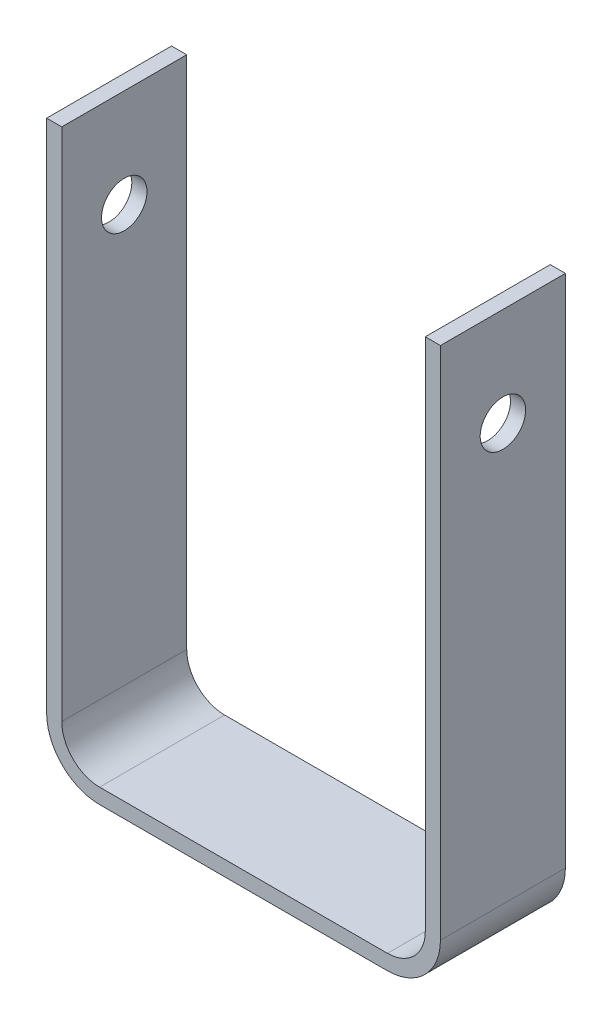
ISO-10303-21;
HEADER;
FILE_DESCRIPTION(('STEP AP214'),'2;1');
FILE_NAME('part.step','',(''),(''),'','','');
FILE_SCHEMA(('AUTOMOTIVE_DESIGN { 1 0 10303 214 1 1 1 1 }'));
ENDSEC;
DATA;
#1=APPLICATION_CONTEXT('core data for automotive mechanical design processes');
#2=APPLICATION_PROTOCOL_DEFINITION('international standard','automotive_design',2000,#1);
#3=PRODUCT_CONTEXT('',#1,'mechanical');
#4=PRODUCT('Part','Part','',(#3));
#5=PRODUCT_RELATED_PRODUCT_CATEGORY('part','',(#4));
#6=PRODUCT_DEFINITION_FORMATION('','',#4);
#7=PRODUCT_DEFINITION_CONTEXT('part definition',#1,'design');
#8=PRODUCT_DEFINITION('design','',#6,#7);
#9=PRODUCT_DEFINITION_SHAPE('','',#8);
#10=(LENGTH_UNIT() NAMED_UNIT(*) SI_UNIT(.MILLI.,.METRE.));
#11=(NAMED_UNIT(*) PLANE_ANGLE_UNIT() SI_UNIT($,.RADIAN.));
#12=(NAMED_UNIT(*) SI_UNIT($,.STERADIAN.) SOLID_ANGLE_UNIT());
#13=UNCERTAINTY_MEASURE_WITH_UNIT(LENGTH_MEASURE(1.E-05),#10,'distance_accuracy_value','');
#14=(GEOMETRIC_REPRESENTATION_CONTEXT(3) GLOBAL_UNCERTAINTY_ASSIGNED_CONTEXT((#13)) GLOBAL_UNIT_ASSIGNED_CONTEXT((#10,
#11,#12)) REPRESENTATION_CONTEXT('',''));
#15=CARTESIAN_POINT('',(0.,0.,0.));
#16=DIRECTION('',(0.,0.,1.));
#17=DIRECTION('',(1.,0.,0.));
#18=AXIS2_PLACEMENT_3D('',#15,#16,#17);
#19=CARTESIAN_POINT('',(38.,14.,33.));
#20=DIRECTION('',(0.,0.,-1.));
#21=DIRECTION('',(-1.,0.,0.));
#22=AXIS2_PLACEMENT_3D('',#19,#20,#21);
#23=CYLINDRICAL_SURFACE('',#22,14.);
#24=CARTESIAN_POINT('',(38.,14.,0.));
#25=DIRECTION('',(0.,0.,1.));
#26=DIRECTION('',(1.,0.,0.));
#27=AXIS2_PLACEMENT_3D('',#24,#25,#26);
#28=CIRCLE('',#27,14.);
#29=CARTESIAN_POINT('',(37.9999999999999,0.,0.));
#30=VERTEX_POINT('',#29);
#31=CARTESIAN_POINT('',(52.,14.0000000000001,0.));
#32=VERTEX_POINT('',#31);
#33=EDGE_CURVE('E155',#30,#32,#28,.T.);
#34=ORIENTED_EDGE('',*,*,#33,.T.);
#35=DIRECTION('',(0.,0.,-1.));
#36=VECTOR('',#35,1.);
#37=CARTESIAN_POINT('',(52.,14.0000000000001,33.));
#38=LINE('',#37,#36);
#39=CARTESIAN_POINT('',(52.,14.0000000000001,33.));
#40=VERTEX_POINT('',#39);
#41=EDGE_CURVE('E11',#40,#32,#38,.T.);
#42=ORIENTED_EDGE('',*,*,#41,.F.);
#43=CARTESIAN_POINT('',(38.,14.,33.));
#44=DIRECTION('',(0.,0.,1.));
#45=DIRECTION('',(1.,0.,0.));
#46=AXIS2_PLACEMENT_3D('',#43,#44,#45);
#47=CIRCLE('',#46,14.);
#48=CARTESIAN_POINT('',(37.9999999999999,0.,33.));
#49=VERTEX_POINT('',#48);
#50=EDGE_CURVE('E180',#49,#40,#47,.T.);
#51=ORIENTED_EDGE('',*,*,#50,.F.);
#52=DIRECTION('',(0.,0.,-1.));
#53=VECTOR('',#52,1.);
#54=CARTESIAN_POINT('',(37.9999999999999,0.,33.));
#55=LINE('',#54,#53);
#56=EDGE_CURVE('E151',#49,#30,#55,.T.);
#57=ORIENTED_EDGE('',*,*,#56,.T.);
#58=EDGE_LOOP('',(#34,#42,#51,#57));
#59=FACE_BOUND('',#58,.T.);
#60=ADVANCED_FACE('F34',(#59),#23,.T.);
#61=CARTESIAN_POINT('',(52.,14.0000000000001,33.));
#62=DIRECTION('',(-1.,0.,0.));
#63=DIRECTION('',(0.,0.,1.));
#64=AXIS2_PLACEMENT_3D('',#61,#62,#63);
#65=PLANE('',#64);
#66=CARTESIAN_POINT('',(52.,124.,16.5));
#67=DIRECTION('',(-1.,0.,0.));
#68=DIRECTION('',(0.,0.,1.));
#69=AXIS2_PLACEMENT_3D('',#66,#67,#68);
#70=CIRCLE('',#69,6.);
#71=CARTESIAN_POINT('',(52.,124.,10.5));
#72=VERTEX_POINT('',#71);
#73=EDGE_CURVE('E159',#72,#72,#70,.T.);
#74=ORIENTED_EDGE('',*,*,#73,.T.);
#75=EDGE_LOOP('',(#74));
#76=FACE_BOUND('',#75,.T.);
#77=DIRECTION('',(0.,1.,0.));
#78=VECTOR('',#77,1.);
#79=CARTESIAN_POINT('',(52.,14.0000000000001,0.));
#80=LINE('',#79,#78);
#81=CARTESIAN_POINT('',(52.,150.,0.));
#82=VERTEX_POINT('',#81);
#83=EDGE_CURVE('E158',#32,#82,#80,.T.);
#84=ORIENTED_EDGE('',*,*,#83,.T.);
#85=DIRECTION('',(0.,0.,-1.));
#86=VECTOR('',#85,1.);
#87=CARTESIAN_POINT('',(52.,150.,33.));
#88=LINE('',#87,#86);
#89=CARTESIAN_POINT('',(52.,150.,33.));
#90=VERTEX_POINT('',#89);
#91=EDGE_CURVE('E42',#90,#82,#88,.T.);
#92=ORIENTED_EDGE('',*,*,#91,.F.);
#93=DIRECTION('',(0.,1.,0.));
#94=VECTOR('',#93,1.);
#95=CARTESIAN_POINT('',(52.,14.0000000000001,33.));
#96=LINE('',#95,#94);
#97=EDGE_CURVE('E103',#40,#90,#96,.T.);
#98=ORIENTED_EDGE('',*,*,#97,.F.);
#99=ORIENTED_EDGE('',*,*,#41,.T.);
#100=EDGE_LOOP('',(#84,#92,#98,#99));
#101=FACE_BOUND('',#100,.T.);
#102=ADVANCED_FACE('F280',(#76,#101),#65,.F.);
#103=CARTESIAN_POINT('',(48.,150.,33.));
#104=DIRECTION('',(0.,-1.,0.));
#105=DIRECTION('',(0.,0.,-1.));
#106=AXIS2_PLACEMENT_3D('',#103,#104,#105);
#107=PLANE('',#106);
#108=DIRECTION('',(-1.,0.,0.));
#109=VECTOR('',#108,1.);
#110=CARTESIAN_POINT('',(48.,150.,0.));
#111=LINE('',#110,#109);
#112=CARTESIAN_POINT('',(48.,150.,0.));
#113=VERTEX_POINT('',#112);
#114=EDGE_CURVE('E161',#82,#113,#111,.T.);
#115=ORIENTED_EDGE('',*,*,#114,.T.);
#116=DIRECTION('',(0.,0.,-1.));
#117=VECTOR('',#116,1.);
#118=CARTESIAN_POINT('',(48.,150.,33.));
#119=LINE('',#118,#117);
#120=CARTESIAN_POINT('',(48.,150.,33.));
#121=VERTEX_POINT('',#120);
#122=EDGE_CURVE('E199',#121,#113,#119,.T.);
#123=ORIENTED_EDGE('',*,*,#122,.F.);
#124=DIRECTION('',(-1.,0.,0.));
#125=VECTOR('',#124,1.);
#126=CARTESIAN_POINT('',(48.,150.,33.));
#127=LINE('',#126,#125);
#128=EDGE_CURVE('E207',#90,#121,#127,.T.);
#129=ORIENTED_EDGE('',*,*,#128,.F.);
#130=ORIENTED_EDGE('',*,*,#91,.T.);
#131=EDGE_LOOP('',(#115,#123,#129,#130));
#132=FACE_BOUND('',#131,.T.);
#133=ADVANCED_FACE('F205',(#132),#107,.F.);
#134=CARTESIAN_POINT('',(48.,14.0000000000001,33.));
#135=DIRECTION('',(1.,0.,0.));
#136=DIRECTION('',(0.,0.,-1.));
#137=AXIS2_PLACEMENT_3D('',#134,#135,#136);
#138=PLANE('',#137);
#139=CARTESIAN_POINT('',(48.,124.,16.5));
#140=DIRECTION('',(1.,0.,0.));
#141=DIRECTION('',(0.,0.,-1.));
#142=AXIS2_PLACEMENT_3D('',#139,#140,#141);
#143=CIRCLE('',#142,6.);
#144=CARTESIAN_POINT('',(48.,124.,10.5));
#145=VERTEX_POINT('',#144);
#146=EDGE_CURVE('E250',#145,#145,#143,.T.);
#147=ORIENTED_EDGE('',*,*,#146,.T.);
#148=EDGE_LOOP('',(#147));
#149=FACE_BOUND('',#148,.T.);
#150=DIRECTION('',(0.,-1.,0.));
#151=VECTOR('',#150,1.);
#152=CARTESIAN_POINT('',(48.,14.0000000000001,0.));
#153=LINE('',#152,#151);
#154=CARTESIAN_POINT('',(48.,14.0000000000001,0.));
#155=VERTEX_POINT('',#154);
#156=EDGE_CURVE('E163',#113,#155,#153,.T.);
#157=ORIENTED_EDGE('',*,*,#156,.T.);
#158=DIRECTION('',(0.,0.,-1.));
#159=VECTOR('',#158,1.);
#160=CARTESIAN_POINT('',(48.,14.0000000000001,33.));
#161=LINE('',#160,#159);
#162=CARTESIAN_POINT('',(48.,14.0000000000001,33.));
#163=VERTEX_POINT('',#162);
#164=EDGE_CURVE('E196',#163,#155,#161,.T.);
#165=ORIENTED_EDGE('',*,*,#164,.F.);
#166=DIRECTION('',(0.,-1.,0.));
#167=VECTOR('',#166,1.);
#168=CARTESIAN_POINT('',(48.,14.0000000000001,33.));
#169=LINE('',#168,#167);
#170=EDGE_CURVE('E222',#121,#163,#169,.T.);
#171=ORIENTED_EDGE('',*,*,#170,.F.);
#172=ORIENTED_EDGE('',*,*,#122,.T.);
#173=EDGE_LOOP('',(#157,#165,#171,#172));
#174=FACE_BOUND('',#173,.T.);
#175=ADVANCED_FACE('F213',(#149,#174),#138,.F.);
#176=CARTESIAN_POINT('',(38.,14.,33.));
#177=DIRECTION('',(0.,0.,-1.));
#178=DIRECTION('',(-1.,0.,0.));
#179=AXIS2_PLACEMENT_3D('',#176,#177,#178);
#180=CYLINDRICAL_SURFACE('',#179,10.);
#181=CARTESIAN_POINT('',(38.,14.,0.));
#182=DIRECTION('',(0.,0.,-1.));
#183=DIRECTION('',(1.,0.,0.));
#184=AXIS2_PLACEMENT_3D('',#181,#182,#183);
#185=CIRCLE('',#184,10.);
#186=CARTESIAN_POINT('',(37.9999999999999,4.,0.));
#187=VERTEX_POINT('',#186);
#188=EDGE_CURVE('E165',#155,#187,#185,.T.);
#189=ORIENTED_EDGE('',*,*,#188,.T.);
#190=DIRECTION('',(0.,0.,-1.));
#191=VECTOR('',#190,1.);
#192=CARTESIAN_POINT('',(37.9999999999999,4.,33.));
#193=LINE('',#192,#191);
#194=CARTESIAN_POINT('',(37.9999999999999,4.,33.));
#195=VERTEX_POINT('',#194);
#196=EDGE_CURVE('E193',#195,#187,#193,.T.);
#197=ORIENTED_EDGE('',*,*,#196,.F.);
#198=CARTESIAN_POINT('',(38.,14.,33.));
#199=DIRECTION('',(0.,0.,-1.));
#200=DIRECTION('',(1.,0.,0.));
#201=AXIS2_PLACEMENT_3D('',#198,#199,#200);
#202=CIRCLE('',#201,10.);
#203=EDGE_CURVE('E219',#163,#195,#202,.T.);
#204=ORIENTED_EDGE('',*,*,#203,.F.);
#205=ORIENTED_EDGE('',*,*,#164,.T.);
#206=EDGE_LOOP('',(#189,#197,#204,#205));
#207=FACE_BOUND('',#206,.T.);
#208=ADVANCED_FACE('F217',(#207),#180,.F.);
#209=CARTESIAN_POINT('',(0.,4.,33.));
#210=DIRECTION('',(0.,-1.,0.));
#211=DIRECTION('',(0.,0.,-1.));
#212=AXIS2_PLACEMENT_3D('',#209,#210,#211);
#213=PLANE('',#212);
#214=DIRECTION('',(-1.,0.,0.));
#215=VECTOR('',#214,1.);
#216=CARTESIAN_POINT('',(0.,4.,0.));
#217=LINE('',#216,#215);
#218=CARTESIAN_POINT('',(-37.9999999999999,4.,0.));
#219=VERTEX_POINT('',#218);
#220=EDGE_CURVE('E168',#187,#219,#217,.T.);
#221=ORIENTED_EDGE('',*,*,#220,.T.);
#222=DIRECTION('',(0.,0.,-1.));
#223=VECTOR('',#222,1.);
#224=CARTESIAN_POINT('',(-37.9999999999999,4.,33.));
#225=LINE('',#224,#223);
#226=CARTESIAN_POINT('',(-37.9999999999999,4.,33.));
#227=VERTEX_POINT('',#226);
#228=EDGE_CURVE('E190',#227,#219,#225,.T.);
#229=ORIENTED_EDGE('',*,*,#228,.F.);
#230=DIRECTION('',(-1.,0.,0.));
#231=VECTOR('',#230,1.);
#232=CARTESIAN_POINT('',(0.,4.,33.));
#233=LINE('',#232,#231);
#234=EDGE_CURVE('E221',#195,#227,#233,.T.);
#235=ORIENTED_EDGE('',*,*,#234,.F.);
#236=ORIENTED_EDGE('',*,*,#196,.T.);
#237=EDGE_LOOP('',(#221,#229,#235,#236));
#238=FACE_BOUND('',#237,.T.);
#239=ADVANCED_FACE('F276',(#238),#213,.F.);
#240=CARTESIAN_POINT('',(-38.,14.,33.));
#241=DIRECTION('',(0.,0.,-1.));
#242=DIRECTION('',(-1.,0.,0.));
#243=AXIS2_PLACEMENT_3D('',#240,#241,#242);
#244=CYLINDRICAL_SURFACE('',#243,10.);
#245=CARTESIAN_POINT('',(-38.,14.,0.));
#246=DIRECTION('',(0.,0.,-1.));
#247=DIRECTION('',(-1.,0.,0.));
#248=AXIS2_PLACEMENT_3D('',#245,#246,#247);
#249=CIRCLE('',#248,10.);
#250=CARTESIAN_POINT('',(-48.,14.0000000000001,0.));
#251=VERTEX_POINT('',#250);
#252=EDGE_CURVE('E170',#219,#251,#249,.T.);
#253=ORIENTED_EDGE('',*,*,#252,.T.);
#254=DIRECTION('',(0.,0.,-1.));
#255=VECTOR('',#254,1.);
#256=CARTESIAN_POINT('',(-48.,14.0000000000001,33.));
#257=LINE('',#256,#255);
#258=CARTESIAN_POINT('',(-48.,14.0000000000001,33.));
#259=VERTEX_POINT('',#258);
#260=EDGE_CURVE('E187',#259,#251,#257,.T.);
#261=ORIENTED_EDGE('',*,*,#260,.F.);
#262=CARTESIAN_POINT('',(-38.,14.,33.));
#263=DIRECTION('',(0.,0.,-1.));
#264=DIRECTION('',(-1.,0.,0.));
#265=AXIS2_PLACEMENT_3D('',#262,#263,#264);
#266=CIRCLE('',#265,10.);
#267=EDGE_CURVE('E224',#227,#259,#266,.T.);
#268=ORIENTED_EDGE('',*,*,#267,.F.);
#269=ORIENTED_EDGE('',*,*,#228,.T.);
#270=EDGE_LOOP('',(#253,#261,#268,#269));
#271=FACE_BOUND('',#270,.T.);
#272=ADVANCED_FACE('F269',(#271),#244,.F.);
#273=CARTESIAN_POINT('',(-48.,14.0000000000001,33.));
#274=DIRECTION('',(-1.,0.,0.));
#275=DIRECTION('',(0.,0.,1.));
#276=AXIS2_PLACEMENT_3D('',#273,#274,#275);
#277=PLANE('',#276);
#278=CARTESIAN_POINT('',(-48.,124.,16.5));
#279=DIRECTION('',(-1.,0.,0.));
#280=DIRECTION('',(0.,0.,1.));
#281=AXIS2_PLACEMENT_3D('',#278,#279,#280);
#282=CIRCLE('',#281,6.);
#283=CARTESIAN_POINT('',(-48.,124.,10.5));
#284=VERTEX_POINT('',#283);
#285=EDGE_CURVE('E253',#284,#284,#282,.T.);
#286=ORIENTED_EDGE('',*,*,#285,.T.);
#287=EDGE_LOOP('',(#286));
#288=FACE_BOUND('',#287,.T.);
#289=DIRECTION('',(0.,1.,0.));
#290=VECTOR('',#289,1.);
#291=CARTESIAN_POINT('',(-48.,14.0000000000001,0.));
#292=LINE('',#291,#290);
#293=CARTESIAN_POINT('',(-48.,150.,0.));
#294=VERTEX_POINT('',#293);
#295=EDGE_CURVE('E172',#251,#294,#292,.T.);
#296=ORIENTED_EDGE('',*,*,#295,.T.);
#297=DIRECTION('',(0.,0.,-1.));
#298=VECTOR('',#297,1.);
#299=CARTESIAN_POINT('',(-48.,150.,33.));
#300=LINE('',#299,#298);
#301=CARTESIAN_POINT('',(-48.,150.,33.));
#302=VERTEX_POINT('',#301);
#303=EDGE_CURVE('E184',#302,#294,#300,.T.);
#304=ORIENTED_EDGE('',*,*,#303,.F.);
#305=DIRECTION('',(0.,1.,0.));
#306=VECTOR('',#305,1.);
#307=CARTESIAN_POINT('',(-48.,14.0000000000001,33.));
#308=LINE('',#307,#306);
#309=EDGE_CURVE('E230',#259,#302,#308,.T.);
#310=ORIENTED_EDGE('',*,*,#309,.F.);
#311=ORIENTED_EDGE('',*,*,#260,.T.);
#312=EDGE_LOOP('',(#296,#304,#310,#311));
#313=FACE_BOUND('',#312,.T.);
#314=ADVANCED_FACE('F236',(#288,#313),#277,.F.);
#315=CARTESIAN_POINT('',(-48.,150.,33.));
#316=DIRECTION('',(0.,-1.,0.));
#317=DIRECTION('',(0.,0.,-1.));
#318=AXIS2_PLACEMENT_3D('',#315,#316,#317);
#319=PLANE('',#318);
#320=DIRECTION('',(-1.,0.,0.));
#321=VECTOR('',#320,1.);
#322=CARTESIAN_POINT('',(-48.,150.,0.));
#323=LINE('',#322,#321);
#324=CARTESIAN_POINT('',(-52.,150.,0.));
#325=VERTEX_POINT('',#324);
#326=EDGE_CURVE('E174',#294,#325,#323,.T.);
#327=ORIENTED_EDGE('',*,*,#326,.T.);
#328=DIRECTION('',(0.,0.,-1.));
#329=VECTOR('',#328,1.);
#330=CARTESIAN_POINT('',(-52.,150.,33.));
#331=LINE('',#330,#329);
#332=CARTESIAN_POINT('',(-52.,150.,33.));
#333=VERTEX_POINT('',#332);
#334=EDGE_CURVE('E146',#333,#325,#331,.T.);
#335=ORIENTED_EDGE('',*,*,#334,.F.);
#336=DIRECTION('',(-1.,0.,0.));
#337=VECTOR('',#336,1.);
#338=CARTESIAN_POINT('',(-48.,150.,33.));
#339=LINE('',#338,#337);
#340=EDGE_CURVE('E135',#302,#333,#339,.T.);
#341=ORIENTED_EDGE('',*,*,#340,.F.);
#342=ORIENTED_EDGE('',*,*,#303,.T.);
#343=EDGE_LOOP('',(#327,#335,#341,#342));
#344=FACE_BOUND('',#343,.T.);
#345=ADVANCED_FACE('F240',(#344),#319,.F.);
#346=CARTESIAN_POINT('',(-52.,14.0000000000001,33.));
#347=DIRECTION('',(1.,0.,0.));
#348=DIRECTION('',(0.,0.,-1.));
#349=AXIS2_PLACEMENT_3D('',#346,#347,#348);
#350=PLANE('',#349);
#351=CARTESIAN_POINT('',(-52.,124.,16.5));
#352=DIRECTION('',(1.,0.,0.));
#353=DIRECTION('',(0.,0.,-1.));
#354=AXIS2_PLACEMENT_3D('',#351,#352,#353);
#355=CIRCLE('',#354,6.);
#356=CARTESIAN_POINT('',(-52.,124.,10.5));
#357=VERTEX_POINT('',#356);
#358=EDGE_CURVE('E256',#357,#357,#355,.T.);
#359=ORIENTED_EDGE('',*,*,#358,.T.);
#360=EDGE_LOOP('',(#359));
#361=FACE_BOUND('',#360,.T.);
#362=DIRECTION('',(0.,-1.,0.));
#363=VECTOR('',#362,1.);
#364=CARTESIAN_POINT('',(-52.,14.0000000000001,0.));
#365=LINE('',#364,#363);
#366=CARTESIAN_POINT('',(-52.,14.0000000000001,0.));
#367=VERTEX_POINT('',#366);
#368=EDGE_CURVE('E144',#325,#367,#365,.T.);
#369=ORIENTED_EDGE('',*,*,#368,.T.);
#370=DIRECTION('',(0.,0.,-1.));
#371=VECTOR('',#370,1.);
#372=CARTESIAN_POINT('',(-52.,14.0000000000001,33.));
#373=LINE('',#372,#371);
#374=CARTESIAN_POINT('',(-52.,14.0000000000001,33.));
#375=VERTEX_POINT('',#374);
#376=EDGE_CURVE('E141',#375,#367,#373,.T.);
#377=ORIENTED_EDGE('',*,*,#376,.F.);
#378=DIRECTION('',(0.,-1.,0.));
#379=VECTOR('',#378,1.);
#380=CARTESIAN_POINT('',(-52.,14.0000000000001,33.));
#381=LINE('',#380,#379);
#382=EDGE_CURVE('E128',#333,#375,#381,.T.);
#383=ORIENTED_EDGE('',*,*,#382,.F.);
#384=ORIENTED_EDGE('',*,*,#334,.T.);
#385=EDGE_LOOP('',(#369,#377,#383,#384));
#386=FACE_BOUND('',#385,.T.);
#387=ADVANCED_FACE('F142',(#361,#386),#350,.F.);
#388=CARTESIAN_POINT('',(-38.,14.,33.));
#389=DIRECTION('',(0.,0.,-1.));
#390=DIRECTION('',(-1.,0.,0.));
#391=AXIS2_PLACEMENT_3D('',#388,#389,#390);
#392=CYLINDRICAL_SURFACE('',#391,14.);
#393=CARTESIAN_POINT('',(-38.,14.,0.));
#394=DIRECTION('',(0.,0.,1.));
#395=DIRECTION('',(-1.,0.,0.));
#396=AXIS2_PLACEMENT_3D('',#393,#394,#395);
#397=CIRCLE('',#396,14.);
#398=CARTESIAN_POINT('',(-37.9999999999999,0.,0.));
#399=VERTEX_POINT('',#398);
#400=EDGE_CURVE('E177',#367,#399,#397,.T.);
#401=ORIENTED_EDGE('',*,*,#400,.T.);
#402=DIRECTION('',(0.,0.,-1.));
#403=VECTOR('',#402,1.);
#404=CARTESIAN_POINT('',(-37.9999999999999,0.,33.));
#405=LINE('',#404,#403);
#406=CARTESIAN_POINT('',(-37.9999999999999,0.,33.));
#407=VERTEX_POINT('',#406);
#408=EDGE_CURVE('E147',#407,#399,#405,.T.);
#409=ORIENTED_EDGE('',*,*,#408,.F.);
#410=CARTESIAN_POINT('',(-38.,14.,33.));
#411=DIRECTION('',(0.,0.,1.));
#412=DIRECTION('',(-1.,0.,0.));
#413=AXIS2_PLACEMENT_3D('',#410,#411,#412);
#414=CIRCLE('',#413,14.);
#415=EDGE_CURVE('E132',#375,#407,#414,.T.);
#416=ORIENTED_EDGE('',*,*,#415,.F.);
#417=ORIENTED_EDGE('',*,*,#376,.T.);
#418=EDGE_LOOP('',(#401,#409,#416,#417));
#419=FACE_BOUND('',#418,.T.);
#420=ADVANCED_FACE('F149',(#419),#392,.T.);
#421=CARTESIAN_POINT('',(0.,0.,33.));
#422=DIRECTION('',(0.,1.,0.));
#423=DIRECTION('',(0.,0.,1.));
#424=AXIS2_PLACEMENT_3D('',#421,#422,#423);
#425=PLANE('',#424);
#426=DIRECTION('',(1.,0.,0.));
#427=VECTOR('',#426,1.);
#428=CARTESIAN_POINT('',(0.,0.,0.));
#429=LINE('',#428,#427);
#430=EDGE_CURVE('E91',#399,#30,#429,.T.);
#431=ORIENTED_EDGE('',*,*,#430,.T.);
#432=ORIENTED_EDGE('',*,*,#56,.F.);
#433=DIRECTION('',(1.,0.,0.));
#434=VECTOR('',#433,1.);
#435=CARTESIAN_POINT('',(0.,0.,33.));
#436=LINE('',#435,#434);
#437=EDGE_CURVE('E50',#407,#49,#436,.T.);
#438=ORIENTED_EDGE('',*,*,#437,.F.);
#439=ORIENTED_EDGE('',*,*,#408,.T.);
#440=EDGE_LOOP('',(#431,#432,#438,#439));
#441=FACE_BOUND('',#440,.T.);
#442=ADVANCED_FACE('F241',(#441),#425,.F.);
#443=CARTESIAN_POINT('',(38.,14.,33.));
#444=DIRECTION('',(0.,0.,1.));
#445=DIRECTION('',(1.,0.,0.));
#446=AXIS2_PLACEMENT_3D('',#443,#444,#445);
#447=PLANE('',#446);
#448=ORIENTED_EDGE('',*,*,#50,.T.);
#449=ORIENTED_EDGE('',*,*,#97,.T.);
#450=ORIENTED_EDGE('',*,*,#128,.T.);
#451=ORIENTED_EDGE('',*,*,#170,.T.);
#452=ORIENTED_EDGE('',*,*,#203,.T.);
#453=ORIENTED_EDGE('',*,*,#234,.T.);
#454=ORIENTED_EDGE('',*,*,#267,.T.);
#455=ORIENTED_EDGE('',*,*,#309,.T.);
#456=ORIENTED_EDGE('',*,*,#340,.T.);
#457=ORIENTED_EDGE('',*,*,#382,.T.);
#458=ORIENTED_EDGE('',*,*,#415,.T.);
#459=ORIENTED_EDGE('',*,*,#437,.T.);
#460=EDGE_LOOP('',(#448,#449,#450,#451,#452,#453,#454,#455,#456,#457,#458,#459));
#461=FACE_BOUND('',#460,.T.);
#462=ADVANCED_FACE('F130',(#461),#447,.T.);
#463=CARTESIAN_POINT('',(38.,14.,0.));
#464=DIRECTION('',(0.,0.,1.));
#465=DIRECTION('',(1.,0.,0.));
#466=AXIS2_PLACEMENT_3D('',#463,#464,#465);
#467=PLANE('',#466);
#468=ORIENTED_EDGE('',*,*,#33,.F.);
#469=ORIENTED_EDGE('',*,*,#430,.F.);
#470=ORIENTED_EDGE('',*,*,#400,.F.);
#471=ORIENTED_EDGE('',*,*,#368,.F.);
#472=ORIENTED_EDGE('',*,*,#326,.F.);
#473=ORIENTED_EDGE('',*,*,#295,.F.);
#474=ORIENTED_EDGE('',*,*,#252,.F.);
#475=ORIENTED_EDGE('',*,*,#220,.F.);
#476=ORIENTED_EDGE('',*,*,#188,.F.);
#477=ORIENTED_EDGE('',*,*,#156,.F.);
#478=ORIENTED_EDGE('',*,*,#114,.F.);
#479=ORIENTED_EDGE('',*,*,#83,.F.);
#480=EDGE_LOOP('',(#468,#469,#470,#471,#472,#473,#474,#475,#476,#477,#478,#479));
#481=FACE_BOUND('',#480,.T.);
#482=ADVANCED_FACE('F209',(#481),#467,.F.);
#483=CARTESIAN_POINT('',(-52.,124.,16.5));
#484=DIRECTION('',(1.,0.,0.));
#485=DIRECTION('',(0.,0.,-1.));
#486=AXIS2_PLACEMENT_3D('',#483,#484,#485);
#487=CYLINDRICAL_SURFACE('',#486,6.);
#488=CARTESIAN_POINT('',(-52.,124.,10.5));
#489=CARTESIAN_POINT('',(-51.9583333333333,124.,10.5));
#490=CARTESIAN_POINT('',(-51.9166666666667,124.,10.5));
#491=CARTESIAN_POINT('',(-51.8333333333333,124.,10.5));
#492=CARTESIAN_POINT('',(-51.7916666666667,124.,10.5));
#493=CARTESIAN_POINT('',(-51.7083333333333,124.,10.5));
#494=CARTESIAN_POINT('',(-51.6666666666667,124.,10.5));
#495=CARTESIAN_POINT('',(-51.5833333333333,124.,10.5));
#496=CARTESIAN_POINT('',(-51.5416666666667,124.,10.5));
#497=CARTESIAN_POINT('',(-51.4583333333333,124.,10.5));
#498=CARTESIAN_POINT('',(-51.4166666666667,124.,10.5));
#499=CARTESIAN_POINT('',(-51.3333333333333,124.,10.5));
#500=CARTESIAN_POINT('',(-51.2916666666667,124.,10.5));
#501=CARTESIAN_POINT('',(-51.2083333333333,124.,10.5));
#502=CARTESIAN_POINT('',(-51.1666666666667,124.,10.5));
#503=CARTESIAN_POINT('',(-51.0833333333333,124.,10.5));
#504=CARTESIAN_POINT('',(-51.0416666666667,124.,10.5));
#505=CARTESIAN_POINT('',(-50.9583333333333,124.,10.5));
#506=CARTESIAN_POINT('',(-50.9166666666667,124.,10.5));
#507=CARTESIAN_POINT('',(-50.8333333333333,124.,10.5));
#508=CARTESIAN_POINT('',(-50.7916666666667,124.,10.5));
#509=CARTESIAN_POINT('',(-50.7083333333333,124.,10.5));
#510=CARTESIAN_POINT('',(-50.6666666666667,124.,10.5));
#511=CARTESIAN_POINT('',(-50.5833333333333,124.,10.5));
#512=CARTESIAN_POINT('',(-50.5416666666667,124.,10.5));
#513=CARTESIAN_POINT('',(-50.4583333333333,124.,10.5));
#514=CARTESIAN_POINT('',(-50.4166666666667,124.,10.5));
#515=CARTESIAN_POINT('',(-50.3333333333333,124.,10.5));
#516=CARTESIAN_POINT('',(-50.2916666666667,124.,10.5));
#517=CARTESIAN_POINT('',(-50.2083333333333,124.,10.5));
#518=CARTESIAN_POINT('',(-50.1666666666667,124.,10.5));
#519=CARTESIAN_POINT('',(-50.0833333333333,124.,10.5));
#520=CARTESIAN_POINT('',(-50.0416666666667,124.,10.5));
#521=CARTESIAN_POINT('',(-49.9583333333333,124.,10.5));
#522=CARTESIAN_POINT('',(-49.9166666666667,124.,10.5));
#523=CARTESIAN_POINT('',(-49.8333333333333,124.,10.5));
#524=CARTESIAN_POINT('',(-49.7916666666667,124.,10.5));
#525=CARTESIAN_POINT('',(-49.7083333333333,124.,10.5));
#526=CARTESIAN_POINT('',(-49.6666666666667,124.,10.5));
#527=CARTESIAN_POINT('',(-49.5833333333333,124.,10.5));
#528=CARTESIAN_POINT('',(-49.5416666666667,124.,10.5));
#529=CARTESIAN_POINT('',(-49.4583333333333,124.,10.5));
#530=CARTESIAN_POINT('',(-49.4166666666667,124.,10.5));
#531=CARTESIAN_POINT('',(-49.3333333333333,124.,10.5));
#532=CARTESIAN_POINT('',(-49.2916666666667,124.,10.5));
#533=CARTESIAN_POINT('',(-49.2083333333333,124.,10.5));
#534=CARTESIAN_POINT('',(-49.1666666666667,124.,10.5));
#535=CARTESIAN_POINT('',(-49.0833333333333,124.,10.5));
#536=CARTESIAN_POINT('',(-49.0416666666667,124.,10.5));
#537=CARTESIAN_POINT('',(-48.9583333333333,124.,10.5));
#538=CARTESIAN_POINT('',(-48.9166666666667,124.,10.5));
#539=CARTESIAN_POINT('',(-48.8333333333333,124.,10.5));
#540=CARTESIAN_POINT('',(-48.7916666666667,124.,10.5));
#541=CARTESIAN_POINT('',(-48.7083333333333,124.,10.5));
#542=CARTESIAN_POINT('',(-48.6666666666667,124.,10.5));
#543=CARTESIAN_POINT('',(-48.5833333333333,124.,10.5));
#544=CARTESIAN_POINT('',(-48.5416666666667,124.,10.5));
#545=CARTESIAN_POINT('',(-48.4583333333333,124.,10.5));
#546=CARTESIAN_POINT('',(-48.4166666666667,124.,10.5));
#547=CARTESIAN_POINT('',(-48.3333333333333,124.,10.5));
#548=CARTESIAN_POINT('',(-48.2916666666667,124.,10.5));
#549=CARTESIAN_POINT('',(-48.2083333333333,124.,10.5));
#550=CARTESIAN_POINT('',(-48.1666666666667,124.,10.5));
#551=CARTESIAN_POINT('',(-48.0833333333333,124.,10.5));
#552=CARTESIAN_POINT('',(-48.0416666666667,124.,10.5));
#553=CARTESIAN_POINT('',(-48.,124.,10.5));
#554=B_SPLINE_CURVE_WITH_KNOTS('',3,(#488,#489,#490,#491,#492,#493,#494,#495,#496,#497,#498,
#499,#500,#501,#502,#503,#504,#505,#506,#507,#508,#509,#510,#511,#512,#513,#514,#515,#516,#517,
#518,#519,#520,#521,#522,#523,#524,#525,#526,#527,#528,#529,#530,#531,#532,#533,#534,#535,#536,
#537,#538,#539,#540,#541,#542,#543,#544,#545,#546,#547,#548,#549,#550,#551,#552,#553),
.UNSPECIFIED.,.F.,.F.,(4,2,2,2,2,2,2,2,2,2,2,2,2,2,2,2,2,2,2,2,2,2,2,2,2,2,2,2,2,2,2,2,4),(0.,
0.125000000000007,0.250000000000007,0.375000000000007,0.500000000000007,0.625000000000008,
0.750000000000008,0.875000000000008,1.00000000000001,1.12500000000001,1.25000000000001,
1.37500000000001,1.50000000000001,1.62500000000001,1.75000000000001,1.87500000000001,
2.00000000000001,2.12500000000001,2.25000000000001,2.37500000000001,2.50000000000001,
2.62500000000001,2.75000000000001,2.87500000000001,3.00000000000001,3.12500000000001,
3.25000000000001,3.37500000000001,3.50000000000001,3.62500000000001,3.75000000000001,
3.87500000000001,4.00000000000001),.UNSPECIFIED.);
#555=EDGE_CURVE('BSEAM261',#357,#284,#554,.T.);
#556=ORIENTED_EDGE('',*,*,#358,.F.);
#557=ORIENTED_EDGE('',*,*,#285,.F.);
#558=ORIENTED_EDGE('',*,*,#555,.T.);
#559=ORIENTED_EDGE('',*,*,#555,.F.);
#560=EDGE_LOOP('',(#556,#558,#557,#559));
#561=FACE_BOUND('',#560,.T.);
#562=ADVANCED_FACE('F261',(#561),#487,.F.);
#563=CARTESIAN_POINT('',(48.,124.,10.5));
#564=CARTESIAN_POINT('',(48.0416666666667,124.,10.5));
#565=CARTESIAN_POINT('',(48.0833333333333,124.,10.5));
#566=CARTESIAN_POINT('',(48.1666666666667,124.,10.5));
#567=CARTESIAN_POINT('',(48.2083333333333,124.,10.5));
#568=CARTESIAN_POINT('',(48.2916666666667,124.,10.5));
#569=CARTESIAN_POINT('',(48.3333333333333,124.,10.5));
#570=CARTESIAN_POINT('',(48.4166666666667,124.,10.5));
#571=CARTESIAN_POINT('',(48.4583333333333,124.,10.5));
#572=CARTESIAN_POINT('',(48.5416666666667,124.,10.5));
#573=CARTESIAN_POINT('',(48.5833333333333,124.,10.5));
#574=CARTESIAN_POINT('',(48.6666666666667,124.,10.5));
#575=CARTESIAN_POINT('',(48.7083333333333,124.,10.5));
#576=CARTESIAN_POINT('',(48.7916666666667,124.,10.5));
#577=CARTESIAN_POINT('',(48.8333333333333,124.,10.5));
#578=CARTESIAN_POINT('',(48.9166666666667,124.,10.5));
#579=CARTESIAN_POINT('',(48.9583333333333,124.,10.5));
#580=CARTESIAN_POINT('',(49.0416666666667,124.,10.5));
#581=CARTESIAN_POINT('',(49.0833333333333,124.,10.5));
#582=CARTESIAN_POINT('',(49.1666666666667,124.,10.5));
#583=CARTESIAN_POINT('',(49.2083333333333,124.,10.5));
#584=CARTESIAN_POINT('',(49.2916666666667,124.,10.5));
#585=CARTESIAN_POINT('',(49.3333333333333,124.,10.5));
#586=CARTESIAN_POINT('',(49.4166666666667,124.,10.5));
#587=CARTESIAN_POINT('',(49.4583333333333,124.,10.5));
#588=CARTESIAN_POINT('',(49.5416666666667,124.,10.5));
#589=CARTESIAN_POINT('',(49.5833333333333,124.,10.5));
#590=CARTESIAN_POINT('',(49.6666666666667,124.,10.5));
#591=CARTESIAN_POINT('',(49.7083333333333,124.,10.5));
#592=CARTESIAN_POINT('',(49.7916666666667,124.,10.5));
#593=CARTESIAN_POINT('',(49.8333333333333,124.,10.5));
#594=CARTESIAN_POINT('',(49.9166666666667,124.,10.5));
#595=CARTESIAN_POINT('',(49.9583333333333,124.,10.5));
#596=CARTESIAN_POINT('',(50.0416666666667,124.,10.5));
#597=CARTESIAN_POINT('',(50.0833333333333,124.,10.5));
#598=CARTESIAN_POINT('',(50.1666666666667,124.,10.5));
#599=CARTESIAN_POINT('',(50.2083333333333,124.,10.5));
#600=CARTESIAN_POINT('',(50.2916666666667,124.,10.5));
#601=CARTESIAN_POINT('',(50.3333333333333,124.,10.5));
#602=CARTESIAN_POINT('',(50.4166666666667,124.,10.5));
#603=CARTESIAN_POINT('',(50.4583333333333,124.,10.5));
#604=CARTESIAN_POINT('',(50.5416666666667,124.,10.5));
#605=CARTESIAN_POINT('',(50.5833333333333,124.,10.5));
#606=CARTESIAN_POINT('',(50.6666666666667,124.,10.5));
#607=CARTESIAN_POINT('',(50.7083333333333,124.,10.5));
#608=CARTESIAN_POINT('',(50.7916666666667,124.,10.5));
#609=CARTESIAN_POINT('',(50.8333333333333,124.,10.5));
#610=CARTESIAN_POINT('',(50.9166666666667,124.,10.5));
#611=CARTESIAN_POINT('',(50.9583333333333,124.,10.5));
#612=CARTESIAN_POINT('',(51.0416666666667,124.,10.5));
#613=CARTESIAN_POINT('',(51.0833333333333,124.,10.5));
#614=CARTESIAN_POINT('',(51.1666666666667,124.,10.5));
#615=CARTESIAN_POINT('',(51.2083333333333,124.,10.5));
#616=CARTESIAN_POINT('',(51.2916666666667,124.,10.5));
#617=CARTESIAN_POINT('',(51.3333333333333,124.,10.5));
#618=CARTESIAN_POINT('',(51.4166666666667,124.,10.5));
#619=CARTESIAN_POINT('',(51.4583333333333,124.,10.5));
#620=CARTESIAN_POINT('',(51.5416666666667,124.,10.5));
#621=CARTESIAN_POINT('',(51.5833333333333,124.,10.5));
#622=CARTESIAN_POINT('',(51.6666666666667,124.,10.5));
#623=CARTESIAN_POINT('',(51.7083333333333,124.,10.5));
#624=CARTESIAN_POINT('',(51.7916666666667,124.,10.5));
#625=CARTESIAN_POINT('',(51.8333333333333,124.,10.5));
#626=CARTESIAN_POINT('',(51.9166666666667,124.,10.5));
#627=CARTESIAN_POINT('',(51.9583333333333,124.,10.5));
#628=CARTESIAN_POINT('',(52.,124.,10.5));
#629=B_SPLINE_CURVE_WITH_KNOTS('',3,(#563,#564,#565,#566,#567,#568,#569,#570,#571,#572,#573,
#574,#575,#576,#577,#578,#579,#580,#581,#582,#583,#584,#585,#586,#587,#588,#589,#590,#591,#592,
#593,#594,#595,#596,#597,#598,#599,#600,#601,#602,#603,#604,#605,#606,#607,#608,#609,#610,#611,
#612,#613,#614,#615,#616,#617,#618,#619,#620,#621,#622,#623,#624,#625,#626,#627,#628),
.UNSPECIFIED.,.F.,.F.,(4,2,2,2,2,2,2,2,2,2,2,2,2,2,2,2,2,2,2,2,2,2,2,2,2,2,2,2,2,2,2,2,4),(0.,
0.125,0.25,0.375,0.5,0.625000000000001,0.750000000000001,0.875000000000001,1.,1.125,1.25,1.375,
1.5,1.625,1.75,1.875,2.,2.125,2.25,2.375,2.5,2.625,2.75,2.875,3.,3.125,3.25,3.375,3.5,3.625,
3.75,3.875,4.),.UNSPECIFIED.);
#630=EDGE_CURVE('BSEAM264',#145,#72,#629,.T.);
#631=ORIENTED_EDGE('',*,*,#146,.F.);
#632=ORIENTED_EDGE('',*,*,#73,.F.);
#633=ORIENTED_EDGE('',*,*,#630,.T.);
#634=ORIENTED_EDGE('',*,*,#630,.F.);
#635=EDGE_LOOP('',(#631,#633,#632,#634));
#636=FACE_BOUND('',#635,.T.);
#637=ADVANCED_FACE('F264',(#636),#487,.F.);
#638=CLOSED_SHELL('',(#60,#102,#133,#175,#208,#239,#272,#314,#345,#387,#420,#442,#462,#482,#562,#637));
#639=MANIFOLD_SOLID_BREP('B2',#638);
#640=ADVANCED_BREP_SHAPE_REPRESENTATION('',(#18,#639),#14);
#641=SHAPE_DEFINITION_REPRESENTATION(#9,#640);
ENDSEC;
END-ISO-10303-21;
